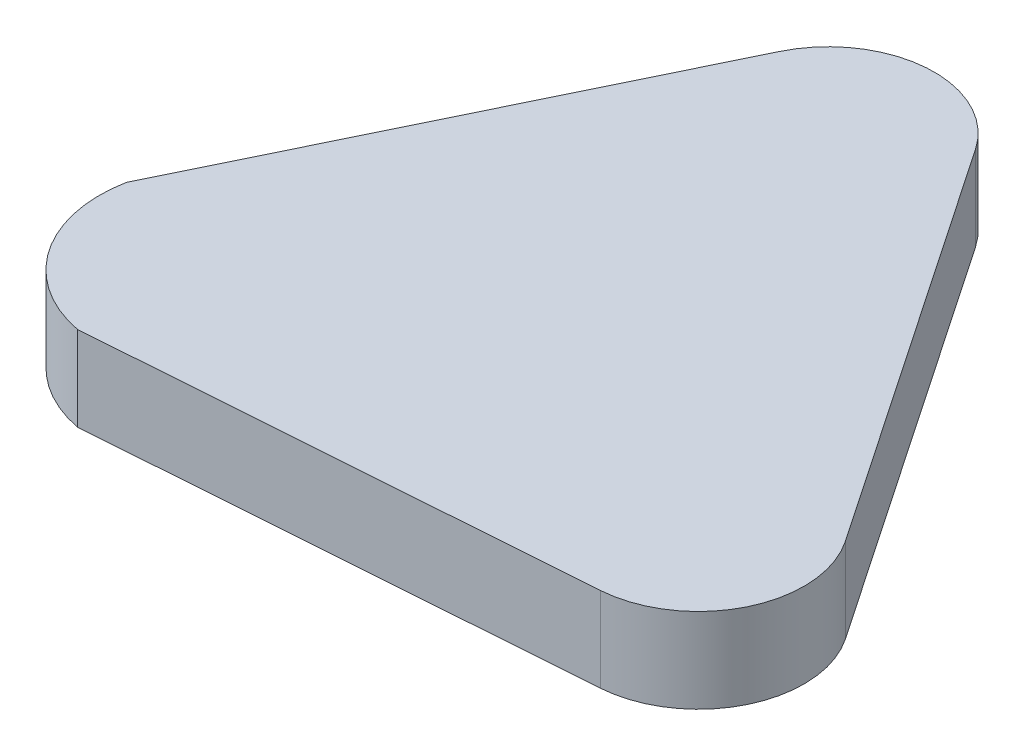
ISO-10303-21;
HEADER;
FILE_DESCRIPTION(('STEP AP214'),'2;1');
FILE_NAME('part.step','',(''),(''),'','','');
FILE_SCHEMA(('AUTOMOTIVE_DESIGN { 1 0 10303 214 1 1 1 1 }'));
ENDSEC;
DATA;
#1=APPLICATION_CONTEXT('core data for automotive mechanical design processes');
#2=APPLICATION_PROTOCOL_DEFINITION('international standard','automotive_design',2000,#1);
#3=PRODUCT_CONTEXT('',#1,'mechanical');
#4=PRODUCT('Part','Part','',(#3));
#5=PRODUCT_RELATED_PRODUCT_CATEGORY('part','',(#4));
#6=PRODUCT_DEFINITION_FORMATION('','',#4);
#7=PRODUCT_DEFINITION_CONTEXT('part definition',#1,'design');
#8=PRODUCT_DEFINITION('design','',#6,#7);
#9=PRODUCT_DEFINITION_SHAPE('','',#8);
#10=(LENGTH_UNIT() NAMED_UNIT(*) SI_UNIT(.MILLI.,.METRE.));
#11=(NAMED_UNIT(*) PLANE_ANGLE_UNIT() SI_UNIT($,.RADIAN.));
#12=(NAMED_UNIT(*) SI_UNIT($,.STERADIAN.) SOLID_ANGLE_UNIT());
#13=UNCERTAINTY_MEASURE_WITH_UNIT(LENGTH_MEASURE(1.E-05),#10,'distance_accuracy_value','');
#14=(GEOMETRIC_REPRESENTATION_CONTEXT(3) GLOBAL_UNCERTAINTY_ASSIGNED_CONTEXT((#13)) GLOBAL_UNIT_ASSIGNED_CONTEXT((#10,
#11,#12)) REPRESENTATION_CONTEXT('',''));
#15=CARTESIAN_POINT('',(0.,0.,0.));
#16=DIRECTION('',(0.,0.,1.));
#17=DIRECTION('',(1.,0.,0.));
#18=AXIS2_PLACEMENT_3D('',#15,#16,#17);
#19=CARTESIAN_POINT('',(30.7079909374275,100.992351318966,423.034925198149));
#20=DIRECTION('',(0.0723992349451321,0.,0.997375731998408));
#21=DIRECTION('',(0.997375731998408,0.,-0.0723992349451321));
#22=AXIS2_PLACEMENT_3D('',#19,#20,#21);
#23=PLANE('',#22);
#24=DIRECTION('',(0.,1.,0.));
#25=VECTOR('',#24,1.);
#26=CARTESIAN_POINT('',(31.5996673336216,100.992351318966,422.970198649436));
#27=LINE('',#26,#25);
#28=CARTESIAN_POINT('',(31.5996673336216,100.992351318966,422.970198649436));
#29=VERTEX_POINT('',#28);
#30=CARTESIAN_POINT('',(31.5996673336216,112.992351318966,422.970198649436));
#31=VERTEX_POINT('',#30);
#32=EDGE_CURVE('E59',#29,#31,#27,.T.);
#33=ORIENTED_EDGE('',*,*,#32,.T.);
#34=DIRECTION('',(0.997375731998408,0.,-0.0723992349451321));
#35=VECTOR('',#34,1.);
#36=CARTESIAN_POINT('',(30.7079909374275,112.992351318966,423.034925198149));
#37=LINE('',#36,#35);
#38=CARTESIAN_POINT('',(-37.5005503486759,112.992351318966,427.986164783599));
#39=VERTEX_POINT('',#38);
#40=EDGE_CURVE('E107',#39,#31,#37,.T.);
#41=ORIENTED_EDGE('',*,*,#40,.F.);
#42=DIRECTION('',(0.,1.,0.));
#43=VECTOR('',#42,1.);
#44=CARTESIAN_POINT('',(-37.5005503486759,100.992351318966,427.986164783599));
#45=LINE('',#44,#43);
#46=CARTESIAN_POINT('',(-37.5005503486759,100.992351318966,427.986164783599));
#47=VERTEX_POINT('',#46);
#48=EDGE_CURVE('E11',#47,#39,#45,.T.);
#49=ORIENTED_EDGE('',*,*,#48,.F.);
#50=DIRECTION('',(0.997375731998408,0.,-0.0723992349451321));
#51=VECTOR('',#50,1.);
#52=CARTESIAN_POINT('',(30.7079909374275,100.992351318966,423.034925198149));
#53=LINE('',#52,#51);
#54=EDGE_CURVE('E131',#47,#29,#53,.T.);
#55=ORIENTED_EDGE('',*,*,#54,.T.);
#56=EDGE_LOOP('',(#33,#41,#49,#55));
#57=FACE_BOUND('',#56,.T.);
#58=ADVANCED_FACE('F43',(#57),#23,.T.);
#59=CARTESIAN_POINT('',(-34.0429569896197,100.992351318966,409.943297822847));
#60=DIRECTION('',(0.,1.,0.));
#61=DIRECTION('',(0.,0.,1.));
#62=AXIS2_PLACEMENT_3D('',#59,#60,#61);
#63=CYLINDRICAL_SURFACE('',#62,18.3711730708739);
#64=ORIENTED_EDGE('',*,*,#48,.T.);
#65=CARTESIAN_POINT('',(-34.0429569896197,112.992351318966,409.943297822847));
#66=DIRECTION('',(0.,-1.,0.));
#67=DIRECTION('',(0.,0.,-1.));
#68=AXIS2_PLACEMENT_3D('',#65,#66,#67);
#69=CIRCLE('',#68,18.3711730708739);
#70=CARTESIAN_POINT('',(-52.0858239503722,112.992351318966,406.48570446379));
#71=VERTEX_POINT('',#70);
#72=EDGE_CURVE('E102',#39,#71,#69,.T.);
#73=ORIENTED_EDGE('',*,*,#72,.T.);
#74=DIRECTION('',(0.,1.,0.));
#75=VECTOR('',#74,1.);
#76=CARTESIAN_POINT('',(-52.0858239503722,100.992351318966,406.48570446379));
#77=LINE('',#76,#75);
#78=CARTESIAN_POINT('',(-52.0858239503722,100.992351318966,406.48570446379));
#79=VERTEX_POINT('',#78);
#80=EDGE_CURVE('E52',#79,#71,#77,.T.);
#81=ORIENTED_EDGE('',*,*,#80,.F.);
#82=CARTESIAN_POINT('',(-34.0429569896197,100.992351318966,409.943297822847));
#83=DIRECTION('',(0.,-1.,0.));
#84=DIRECTION('',(0.,0.,-1.));
#85=AXIS2_PLACEMENT_3D('',#82,#83,#84);
#86=CIRCLE('',#85,18.3711730708739);
#87=EDGE_CURVE('E103',#47,#79,#86,.T.);
#88=ORIENTED_EDGE('',*,*,#87,.F.);
#89=EDGE_LOOP('',(#64,#73,#81,#88));
#90=FACE_BOUND('',#89,.T.);
#91=ADVANCED_FACE('F99',(#90),#63,.T.);
#92=CARTESIAN_POINT('',(117.307210477712,100.992351318966,56.8303095989555));
#93=DIRECTION('',(-0.899952338501288,0.,-0.43598828932216));
#94=DIRECTION('',(-0.43598828932216,0.,0.899952338501288));
#95=AXIS2_PLACEMENT_3D('',#92,#93,#94);
#96=PLANE('',#95);
#97=ORIENTED_EDGE('',*,*,#80,.T.);
#98=DIRECTION('',(-0.43598828932216,0.,0.899952338501288));
#99=VECTOR('',#98,1.);
#100=CARTESIAN_POINT('',(117.307210477712,112.992351318966,56.8303095989555));
#101=LINE('',#100,#99);
#102=CARTESIAN_POINT('',(-21.8796692059314,112.992351318966,344.135177476804));
#103=VERTEX_POINT('',#102);
#104=EDGE_CURVE('E115',#103,#71,#101,.T.);
#105=ORIENTED_EDGE('',*,*,#104,.F.);
#106=DIRECTION('',(0.,1.,0.));
#107=VECTOR('',#106,1.);
#108=CARTESIAN_POINT('',(-21.8796692059314,100.992351318966,344.135177476804));
#109=LINE('',#108,#107);
#110=CARTESIAN_POINT('',(-21.8796692059314,100.992351318966,344.135177476804));
#111=VERTEX_POINT('',#110);
#112=EDGE_CURVE('E157',#111,#103,#109,.T.);
#113=ORIENTED_EDGE('',*,*,#112,.F.);
#114=DIRECTION('',(-0.43598828932216,0.,0.899952338501288));
#115=VECTOR('',#114,1.);
#116=CARTESIAN_POINT('',(117.307210477712,100.992351318966,56.8303095989555));
#117=LINE('',#116,#115);
#118=EDGE_CURVE('E136',#111,#79,#117,.T.);
#119=ORIENTED_EDGE('',*,*,#118,.T.);
#120=EDGE_LOOP('',(#97,#105,#113,#119));
#121=FACE_BOUND('',#120,.T.);
#122=ADVANCED_FACE('F161',(#121),#96,.T.);
#123=CARTESIAN_POINT('',(-8.38038412841204,100.992351318966,350.675001816637));
#124=DIRECTION('',(0.,1.,0.));
#125=DIRECTION('',(0.,0.,1.));
#126=AXIS2_PLACEMENT_3D('',#123,#124,#125);
#127=CYLINDRICAL_SURFACE('',#126,15.);
#128=ORIENTED_EDGE('',*,*,#112,.T.);
#129=CARTESIAN_POINT('',(-8.38038412841205,112.992351318966,350.675001816637));
#130=DIRECTION('',(0.,-1.,0.));
#131=DIRECTION('',(0.,0.,-1.));
#132=AXIS2_PLACEMENT_3D('',#129,#130,#131);
#133=CIRCLE('',#132,15.);
#134=CARTESIAN_POINT('',(4.03291242493025,112.992351318966,342.254190176493));
#135=VERTEX_POINT('',#134);
#136=EDGE_CURVE('E119',#135,#103,#133,.F.);
#137=ORIENTED_EDGE('',*,*,#136,.F.);
#138=DIRECTION('',(0.,1.,0.));
#139=VECTOR('',#138,1.);
#140=CARTESIAN_POINT('',(4.03291242493026,100.992351318966,342.254190176493));
#141=LINE('',#140,#139);
#142=CARTESIAN_POINT('',(4.03291242493026,100.992351318966,342.254190176493));
#143=VERTEX_POINT('',#142);
#144=EDGE_CURVE('E154',#143,#135,#141,.T.);
#145=ORIENTED_EDGE('',*,*,#144,.F.);
#146=CARTESIAN_POINT('',(-8.38038412841204,100.992351318966,350.675001816637));
#147=DIRECTION('',(0.,-1.,0.));
#148=DIRECTION('',(0.,0.,-1.));
#149=AXIS2_PLACEMENT_3D('',#146,#147,#148);
#150=CIRCLE('',#149,15.);
#151=EDGE_CURVE('E140',#143,#111,#150,.F.);
#152=ORIENTED_EDGE('',*,*,#151,.T.);
#153=EDGE_LOOP('',(#128,#137,#145,#152));
#154=FACE_BOUND('',#153,.T.);
#155=ADVANCED_FACE('F167',(#154),#127,.T.);
#156=CARTESIAN_POINT('',(-156.24182351105,100.992351318966,105.989811847753));
#157=DIRECTION('',(0.827553103556157,0.,-0.561387442676244));
#158=DIRECTION('',(-0.561387442676244,0.,-0.827553103556157));
#159=AXIS2_PLACEMENT_3D('',#156,#157,#158);
#160=PLANE('',#159);
#161=ORIENTED_EDGE('',*,*,#144,.T.);
#162=DIRECTION('',(-0.561387442676244,0.,-0.827553103556157));
#163=VECTOR('',#162,1.);
#164=CARTESIAN_POINT('',(-156.24182351105,112.992351318966,105.989811847753));
#165=LINE('',#164,#163);
#166=CARTESIAN_POINT('',(42.9269753627869,112.992351318966,399.588751029316));
#167=VERTEX_POINT('',#166);
#168=EDGE_CURVE('E124',#167,#135,#165,.T.);
#169=ORIENTED_EDGE('',*,*,#168,.F.);
#170=DIRECTION('',(0.,1.,0.));
#171=VECTOR('',#170,1.);
#172=CARTESIAN_POINT('',(42.9269753627869,100.992351318966,399.588751029316));
#173=LINE('',#172,#171);
#174=CARTESIAN_POINT('',(42.9269753627869,100.992351318966,399.588751029316));
#175=VERTEX_POINT('',#174);
#176=EDGE_CURVE('E67',#175,#167,#173,.T.);
#177=ORIENTED_EDGE('',*,*,#176,.F.);
#178=DIRECTION('',(-0.561387442676244,0.,-0.827553103556157));
#179=VECTOR('',#178,1.);
#180=CARTESIAN_POINT('',(-156.24182351105,100.992351318966,105.989811847753));
#181=LINE('',#180,#179);
#182=EDGE_CURVE('E144',#175,#143,#181,.T.);
#183=ORIENTED_EDGE('',*,*,#182,.T.);
#184=EDGE_LOOP('',(#161,#169,#177,#183));
#185=FACE_BOUND('',#184,.T.);
#186=ADVANCED_FACE('F169',(#185),#160,.T.);
#187=CARTESIAN_POINT('',(30.5136788094447,100.992351318966,408.00956266946));
#188=DIRECTION('',(0.,1.,0.));
#189=DIRECTION('',(0.,0.,1.));
#190=AXIS2_PLACEMENT_3D('',#187,#188,#189);
#191=CYLINDRICAL_SURFACE('',#190,15.);
#192=ORIENTED_EDGE('',*,*,#176,.T.);
#193=CARTESIAN_POINT('',(30.5136788094447,112.992351318966,408.00956266946));
#194=DIRECTION('',(0.,-1.,0.));
#195=DIRECTION('',(0.,0.,-1.));
#196=AXIS2_PLACEMENT_3D('',#193,#194,#195);
#197=CIRCLE('',#196,15.);
#198=EDGE_CURVE('E128',#31,#167,#197,.F.);
#199=ORIENTED_EDGE('',*,*,#198,.F.);
#200=ORIENTED_EDGE('',*,*,#32,.F.);
#201=CARTESIAN_POINT('',(30.5136788094447,100.992351318966,408.00956266946));
#202=DIRECTION('',(0.,-1.,0.));
#203=DIRECTION('',(0.,0.,-1.));
#204=AXIS2_PLACEMENT_3D('',#201,#202,#203);
#205=CIRCLE('',#204,15.);
#206=EDGE_CURVE('E147',#29,#175,#205,.F.);
#207=ORIENTED_EDGE('',*,*,#206,.T.);
#208=EDGE_LOOP('',(#192,#199,#200,#207));
#209=FACE_BOUND('',#208,.T.);
#210=ADVANCED_FACE('F170',(#209),#191,.T.);
#211=CARTESIAN_POINT('',(0.,100.992351318966,0.));
#212=DIRECTION('',(0.,-1.,0.));
#213=DIRECTION('',(0.,0.,-1.));
#214=AXIS2_PLACEMENT_3D('',#211,#212,#213);
#215=PLANE('',#214);
#216=ORIENTED_EDGE('',*,*,#54,.F.);
#217=ORIENTED_EDGE('',*,*,#87,.T.);
#218=ORIENTED_EDGE('',*,*,#118,.F.);
#219=ORIENTED_EDGE('',*,*,#151,.F.);
#220=ORIENTED_EDGE('',*,*,#182,.F.);
#221=ORIENTED_EDGE('',*,*,#206,.F.);
#222=EDGE_LOOP('',(#216,#217,#218,#219,#220,#221));
#223=FACE_BOUND('',#222,.T.);
#224=ADVANCED_FACE('F165',(#223),#215,.T.);
#225=CARTESIAN_POINT('',(-38.5865388728529,112.992351318966,413.025528803623));
#226=DIRECTION('',(0.,-1.,0.));
#227=DIRECTION('',(0.,0.,-1.));
#228=AXIS2_PLACEMENT_3D('',#225,#226,#227);
#229=PLANE('',#228);
#230=ORIENTED_EDGE('',*,*,#40,.T.);
#231=ORIENTED_EDGE('',*,*,#198,.T.);
#232=ORIENTED_EDGE('',*,*,#168,.T.);
#233=ORIENTED_EDGE('',*,*,#136,.T.);
#234=ORIENTED_EDGE('',*,*,#104,.T.);
#235=ORIENTED_EDGE('',*,*,#72,.F.);
#236=EDGE_LOOP('',(#230,#231,#232,#233,#234,#235));
#237=FACE_BOUND('',#236,.T.);
#238=ADVANCED_FACE('F45',(#237),#229,.F.);
#239=CLOSED_SHELL('',(#58,#91,#122,#155,#186,#210,#224,#238));
#240=MANIFOLD_SOLID_BREP('B2',#239);
#241=ADVANCED_BREP_SHAPE_REPRESENTATION('',(#18,#240),#14);
#242=SHAPE_DEFINITION_REPRESENTATION(#9,#241);
ENDSEC;
END-ISO-10303-21;
